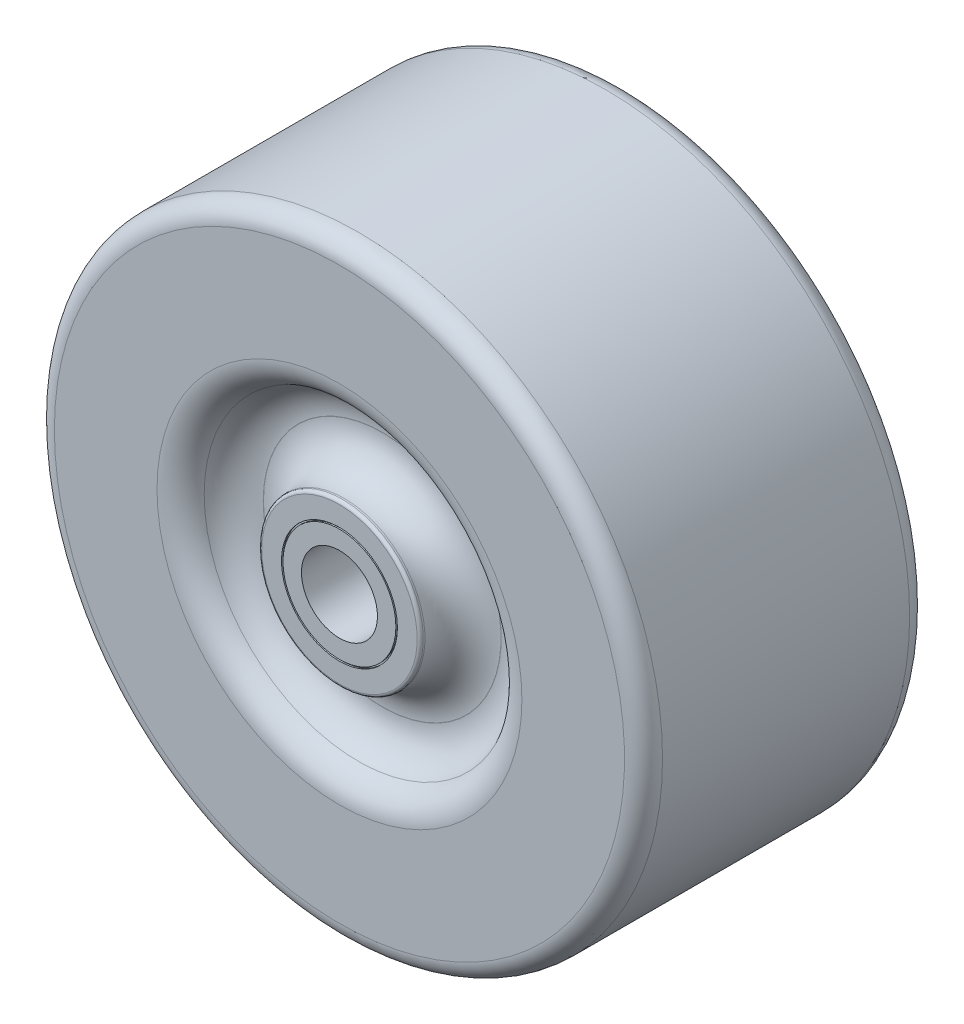
ISO-10303-21;
HEADER;
FILE_DESCRIPTION(('STEP AP214'),'2;1');
FILE_NAME('part.step','',(''),(''),'','','');
FILE_SCHEMA(('AUTOMOTIVE_DESIGN { 1 0 10303 214 1 1 1 1 }'));
ENDSEC;
DATA;
#1=APPLICATION_CONTEXT('core data for automotive mechanical design processes');
#2=APPLICATION_PROTOCOL_DEFINITION('international standard','automotive_design',2000,#1);
#3=PRODUCT_CONTEXT('',#1,'mechanical');
#4=PRODUCT('Part','Part','',(#3));
#5=PRODUCT_RELATED_PRODUCT_CATEGORY('part','',(#4));
#6=PRODUCT_DEFINITION_FORMATION('','',#4);
#7=PRODUCT_DEFINITION_CONTEXT('part definition',#1,'design');
#8=PRODUCT_DEFINITION('design','',#6,#7);
#9=PRODUCT_DEFINITION_SHAPE('','',#8);
#10=(LENGTH_UNIT() NAMED_UNIT(*) SI_UNIT(.MILLI.,.METRE.));
#11=(NAMED_UNIT(*) PLANE_ANGLE_UNIT() SI_UNIT($,.RADIAN.));
#12=(NAMED_UNIT(*) SI_UNIT($,.STERADIAN.) SOLID_ANGLE_UNIT());
#13=UNCERTAINTY_MEASURE_WITH_UNIT(LENGTH_MEASURE(1.E-05),#10,'distance_accuracy_value','');
#14=(GEOMETRIC_REPRESENTATION_CONTEXT(3) GLOBAL_UNCERTAINTY_ASSIGNED_CONTEXT((#13)) GLOBAL_UNIT_ASSIGNED_CONTEXT((#10,
#11,#12)) REPRESENTATION_CONTEXT('',''));
#15=CARTESIAN_POINT('',(0.,0.,0.));
#16=DIRECTION('',(0.,0.,1.));
#17=DIRECTION('',(1.,0.,0.));
#18=AXIS2_PLACEMENT_3D('',#15,#16,#17);
#19=CARTESIAN_POINT('',(4.71487499999999,0.,11.90625));
#20=DIRECTION('',(0.,0.,-1.));
#21=DIRECTION('',(-1.,0.,0.));
#22=AXIS2_PLACEMENT_3D('',#19,#20,#21);
#23=PLANE('',#22);
#24=CARTESIAN_POINT('',(0.,0.,11.90625));
#25=DIRECTION('',(0.,0.,1.));
#26=DIRECTION('',(1.,0.,0.));
#27=AXIS2_PLACEMENT_3D('',#24,#25,#26);
#28=CIRCLE('',#27,3.175);
#29=CARTESIAN_POINT('',(3.175,0.,11.90625));
#30=VERTEX_POINT('',#29);
#31=EDGE_CURVE('E90',#30,#30,#28,.T.);
#32=ORIENTED_EDGE('',*,*,#31,.F.);
#33=EDGE_LOOP('',(#32));
#34=FACE_BOUND('',#33,.T.);
#35=CARTESIAN_POINT('',(0.,0.,11.90625));
#36=DIRECTION('',(0.,0.,1.));
#37=DIRECTION('',(1.,0.,0.));
#38=AXIS2_PLACEMENT_3D('',#35,#36,#37);
#39=CIRCLE('',#38,4.71487499999999);
#40=CARTESIAN_POINT('',(4.71487499999999,0.,11.90625));
#41=VERTEX_POINT('',#40);
#42=EDGE_CURVE('E102',#41,#41,#39,.T.);
#43=ORIENTED_EDGE('',*,*,#42,.T.);
#44=EDGE_LOOP('',(#43));
#45=FACE_BOUND('',#44,.T.);
#46=ADVANCED_FACE('F37',(#34,#45),#23,.F.);
#47=CARTESIAN_POINT('',(0.,0.,16.1183378076554));
#48=DIRECTION('',(0.,0.,1.));
#49=DIRECTION('',(1.,0.,0.));
#50=AXIS2_PLACEMENT_3D('',#47,#48,#49);
#51=CYLINDRICAL_SURFACE('',#50,3.175);
#52=CARTESIAN_POINT('',(0.,0.,-11.90625));
#53=DIRECTION('',(0.,0.,1.));
#54=DIRECTION('',(1.,0.,0.));
#55=AXIS2_PLACEMENT_3D('',#52,#53,#54);
#56=CIRCLE('',#55,3.175);
#57=CARTESIAN_POINT('',(3.175,0.,-11.90625));
#58=VERTEX_POINT('',#57);
#59=EDGE_CURVE('E114',#58,#58,#56,.T.);
#60=ORIENTED_EDGE('',*,*,#59,.F.);
#61=EDGE_LOOP('',(#60));
#62=FACE_BOUND('',#61,.T.);
#63=ORIENTED_EDGE('',*,*,#31,.T.);
#64=EDGE_LOOP('',(#63));
#65=FACE_BOUND('',#64,.T.);
#66=ADVANCED_FACE('F150',(#62,#65),#51,.F.);
#67=CARTESIAN_POINT('',(0.,0.,16.1183378076554));
#68=DIRECTION('',(0.,0.,1.));
#69=DIRECTION('',(1.,0.,0.));
#70=AXIS2_PLACEMENT_3D('',#67,#68,#69);
#71=CYLINDRICAL_SURFACE('',#70,25.4);
#72=CARTESIAN_POINT('',(0.,0.,-10.31875));
#73=DIRECTION('',(0.,0.,1.));
#74=DIRECTION('',(1.,0.,0.));
#75=AXIS2_PLACEMENT_3D('',#72,#73,#74);
#76=CIRCLE('',#75,25.4);
#77=CARTESIAN_POINT('',(25.4,0.,-10.31875));
#78=VERTEX_POINT('',#77);
#79=EDGE_CURVE('E48',#78,#78,#76,.T.);
#80=ORIENTED_EDGE('',*,*,#79,.T.);
#81=EDGE_LOOP('',(#80));
#82=FACE_BOUND('',#81,.T.);
#83=CARTESIAN_POINT('',(0.,0.,10.31875));
#84=DIRECTION('',(0.,0.,-1.));
#85=DIRECTION('',(-1.,0.,0.));
#86=AXIS2_PLACEMENT_3D('',#83,#84,#85);
#87=CIRCLE('',#86,25.4);
#88=CARTESIAN_POINT('',(-25.4,0.,10.31875));
#89=VERTEX_POINT('',#88);
#90=EDGE_CURVE('E52',#89,#89,#87,.T.);
#91=ORIENTED_EDGE('',*,*,#90,.T.);
#92=EDGE_LOOP('',(#91));
#93=FACE_BOUND('',#92,.T.);
#94=ADVANCED_FACE('F156',(#82,#93),#71,.T.);
#95=CARTESIAN_POINT('',(25.4,0.,11.90625));
#96=DIRECTION('',(0.,0.,-1.));
#97=DIRECTION('',(-1.,0.,0.));
#98=AXIS2_PLACEMENT_3D('',#95,#96,#97);
#99=PLANE('',#98);
#100=CARTESIAN_POINT('',(0.,0.,11.90625));
#101=DIRECTION('',(0.,0.,-1.));
#102=DIRECTION('',(-1.,0.,0.));
#103=AXIS2_PLACEMENT_3D('',#100,#101,#102);
#104=CIRCLE('',#103,23.8125);
#105=CARTESIAN_POINT('',(-23.8125,0.,11.90625));
#106=VERTEX_POINT('',#105);
#107=EDGE_CURVE('E10',#106,#106,#104,.F.);
#108=ORIENTED_EDGE('',*,*,#107,.T.);
#109=EDGE_LOOP('',(#108));
#110=FACE_BOUND('',#109,.T.);
#111=CARTESIAN_POINT('',(0.,0.,11.90625));
#112=DIRECTION('',(0.,0.,-1.));
#113=DIRECTION('',(-1.,0.,0.));
#114=AXIS2_PLACEMENT_3D('',#111,#112,#113);
#115=CIRCLE('',#114,15.24);
#116=CARTESIAN_POINT('',(-15.24,0.,11.90625));
#117=VERTEX_POINT('',#116);
#118=EDGE_CURVE('E87',#117,#117,#115,.T.);
#119=ORIENTED_EDGE('',*,*,#118,.T.);
#120=EDGE_LOOP('',(#119));
#121=FACE_BOUND('',#120,.T.);
#122=ADVANCED_FACE('F188',(#110,#121),#99,.F.);
#123=CARTESIAN_POINT('',(12.7,0.,8.334375));
#124=DIRECTION('',(0.,0.,-1.));
#125=DIRECTION('',(-1.,0.,0.));
#126=AXIS2_PLACEMENT_3D('',#123,#124,#125);
#127=PLANE('',#126);
#128=CARTESIAN_POINT('',(0.,0.,8.334375));
#129=DIRECTION('',(0.,0.,-1.));
#130=DIRECTION('',(-1.,0.,0.));
#131=AXIS2_PLACEMENT_3D('',#128,#129,#130);
#132=CIRCLE('',#131,9.921875);
#133=CARTESIAN_POINT('',(-9.921875,0.,8.334375));
#134=VERTEX_POINT('',#133);
#135=EDGE_CURVE('E60',#134,#134,#132,.T.);
#136=ORIENTED_EDGE('',*,*,#135,.T.);
#137=EDGE_LOOP('',(#136));
#138=FACE_BOUND('',#137,.T.);
#139=CARTESIAN_POINT('',(0.,0.,8.334375));
#140=DIRECTION('',(0.,0.,-1.));
#141=DIRECTION('',(-1.,0.,0.));
#142=AXIS2_PLACEMENT_3D('',#139,#140,#141);
#143=CIRCLE('',#142,9.94205320578104);
#144=CARTESIAN_POINT('',(-9.94205320578104,0.,8.334375));
#145=VERTEX_POINT('',#144);
#146=EDGE_CURVE('E63',#145,#145,#143,.F.);
#147=ORIENTED_EDGE('',*,*,#146,.T.);
#148=EDGE_LOOP('',(#147));
#149=FACE_BOUND('',#148,.T.);
#150=ADVANCED_FACE('F184',(#138,#149),#127,.F.);
#151=CARTESIAN_POINT('',(0.,0.,16.1183378076554));
#152=DIRECTION('',(0.,0.,1.));
#153=DIRECTION('',(1.,0.,0.));
#154=AXIS2_PLACEMENT_3D('',#151,#152,#153);
#155=CYLINDRICAL_SURFACE('',#154,6.746875);
#156=CARTESIAN_POINT('',(0.,0.,11.509375));
#157=DIRECTION('',(0.,0.,-1.));
#158=DIRECTION('',(-1.,0.,0.));
#159=AXIS2_PLACEMENT_3D('',#156,#157,#158);
#160=CIRCLE('',#159,6.746875);
#161=CARTESIAN_POINT('',(-6.746875,0.,11.509375));
#162=VERTEX_POINT('',#161);
#163=EDGE_CURVE('E66',#162,#162,#160,.F.);
#164=ORIENTED_EDGE('',*,*,#163,.T.);
#165=EDGE_LOOP('',(#164));
#166=FACE_BOUND('',#165,.T.);
#167=CARTESIAN_POINT('',(0.,0.,11.65225));
#168=DIRECTION('',(0.,0.,-1.));
#169=DIRECTION('',(-1.,0.,0.));
#170=AXIS2_PLACEMENT_3D('',#167,#168,#169);
#171=CIRCLE('',#170,6.746875);
#172=CARTESIAN_POINT('',(-6.746875,0.,11.65225));
#173=VERTEX_POINT('',#172);
#174=EDGE_CURVE('E81',#173,#173,#171,.T.);
#175=ORIENTED_EDGE('',*,*,#174,.T.);
#176=EDGE_LOOP('',(#175));
#177=FACE_BOUND('',#176,.T.);
#178=ADVANCED_FACE('F180',(#166,#177),#155,.T.);
#179=CARTESIAN_POINT('',(6.74687499999999,0.,11.90625));
#180=DIRECTION('',(0.,0.,-1.));
#181=DIRECTION('',(-1.,0.,0.));
#182=AXIS2_PLACEMENT_3D('',#179,#180,#181);
#183=PLANE('',#182);
#184=CARTESIAN_POINT('',(0.,0.,11.90625));
#185=DIRECTION('',(0.,0.,1.));
#186=DIRECTION('',(1.,0.,0.));
#187=AXIS2_PLACEMENT_3D('',#184,#185,#186);
#188=CIRCLE('',#187,4.841875);
#189=CARTESIAN_POINT('',(4.841875,0.,11.90625));
#190=VERTEX_POINT('',#189);
#191=EDGE_CURVE('E93',#190,#190,#188,.T.);
#192=ORIENTED_EDGE('',*,*,#191,.F.);
#193=EDGE_LOOP('',(#192));
#194=FACE_BOUND('',#193,.T.);
#195=CARTESIAN_POINT('',(0.,0.,11.90625));
#196=DIRECTION('',(0.,0.,-1.));
#197=DIRECTION('',(-1.,0.,0.));
#198=AXIS2_PLACEMENT_3D('',#195,#196,#197);
#199=CIRCLE('',#198,6.492875);
#200=CARTESIAN_POINT('',(-6.492875,0.,11.90625));
#201=VERTEX_POINT('',#200);
#202=EDGE_CURVE('E84',#201,#201,#199,.F.);
#203=ORIENTED_EDGE('',*,*,#202,.T.);
#204=EDGE_LOOP('',(#203));
#205=FACE_BOUND('',#204,.T.);
#206=ADVANCED_FACE('F176',(#194,#205),#183,.F.);
#207=CARTESIAN_POINT('',(0.,0.,16.1183378076554));
#208=DIRECTION('',(0.,0.,1.));
#209=DIRECTION('',(1.,0.,0.));
#210=AXIS2_PLACEMENT_3D('',#207,#208,#209);
#211=CYLINDRICAL_SURFACE('',#210,4.841875);
#212=CARTESIAN_POINT('',(0.,0.,11.77925));
#213=DIRECTION('',(0.,0.,1.));
#214=DIRECTION('',(1.,0.,0.));
#215=AXIS2_PLACEMENT_3D('',#212,#213,#214);
#216=CIRCLE('',#215,4.841875);
#217=CARTESIAN_POINT('',(4.841875,0.,11.77925));
#218=VERTEX_POINT('',#217);
#219=EDGE_CURVE('E96',#218,#218,#216,.T.);
#220=ORIENTED_EDGE('',*,*,#219,.F.);
#221=EDGE_LOOP('',(#220));
#222=FACE_BOUND('',#221,.T.);
#223=ORIENTED_EDGE('',*,*,#191,.T.);
#224=EDGE_LOOP('',(#223));
#225=FACE_BOUND('',#224,.T.);
#226=ADVANCED_FACE('F172',(#222,#225),#211,.F.);
#227=CARTESIAN_POINT('',(4.841875,0.,11.77925));
#228=DIRECTION('',(0.,0.,-1.));
#229=DIRECTION('',(-1.,0.,0.));
#230=AXIS2_PLACEMENT_3D('',#227,#228,#229);
#231=PLANE('',#230);
#232=CARTESIAN_POINT('',(0.,0.,11.77925));
#233=DIRECTION('',(0.,0.,1.));
#234=DIRECTION('',(1.,0.,0.));
#235=AXIS2_PLACEMENT_3D('',#232,#233,#234);
#236=CIRCLE('',#235,4.71487499999999);
#237=CARTESIAN_POINT('',(4.71487499999999,0.,11.77925));
#238=VERTEX_POINT('',#237);
#239=EDGE_CURVE('E99',#238,#238,#236,.T.);
#240=ORIENTED_EDGE('',*,*,#239,.F.);
#241=EDGE_LOOP('',(#240));
#242=FACE_BOUND('',#241,.T.);
#243=ORIENTED_EDGE('',*,*,#219,.T.);
#244=EDGE_LOOP('',(#243));
#245=FACE_BOUND('',#244,.T.);
#246=ADVANCED_FACE('F168',(#242,#245),#231,.F.);
#247=CARTESIAN_POINT('',(0.,0.,16.1183378076554));
#248=DIRECTION('',(0.,0.,1.));
#249=DIRECTION('',(1.,0.,0.));
#250=AXIS2_PLACEMENT_3D('',#247,#248,#249);
#251=CYLINDRICAL_SURFACE('',#250,4.71487499999999);
#252=ORIENTED_EDGE('',*,*,#42,.F.);
#253=EDGE_LOOP('',(#252));
#254=FACE_BOUND('',#253,.T.);
#255=ORIENTED_EDGE('',*,*,#239,.T.);
#256=EDGE_LOOP('',(#255));
#257=FACE_BOUND('',#256,.T.);
#258=ADVANCED_FACE('F165',(#254,#257),#251,.T.);
#259=CARTESIAN_POINT('',(0.,0.,9.36625));
#260=DIRECTION('',(0.,0.,-1.));
#261=DIRECTION('',(-1.,0.,0.));
#262=AXIS2_PLACEMENT_3D('',#259,#260,#261);
#263=TOROIDAL_SURFACE('',#262,15.24,2.54);
#264=CARTESIAN_POINT('',(0.,0.,10.31875));
#265=DIRECTION('',(0.,0.,-1.));
#266=DIRECTION('',(-1.,0.,0.));
#267=AXIS2_PLACEMENT_3D('',#264,#265,#266);
#268=CIRCLE('',#267,12.8853569803471);
#269=CARTESIAN_POINT('',(-12.8853569803471,0.,10.31875));
#270=VERTEX_POINT('',#269);
#271=EDGE_CURVE('E57',#270,#270,#268,.T.);
#272=ORIENTED_EDGE('',*,*,#271,.T.);
#273=EDGE_LOOP('',(#272));
#274=FACE_BOUND('',#273,.T.);
#275=ORIENTED_EDGE('',*,*,#118,.F.);
#276=EDGE_LOOP('',(#275));
#277=FACE_BOUND('',#276,.T.);
#278=ADVANCED_FACE('F145',(#274,#277),#263,.T.);
#279=CARTESIAN_POINT('',(0.,0.,11.65225));
#280=DIRECTION('',(0.,0.,-1.));
#281=DIRECTION('',(-1.,0.,0.));
#282=AXIS2_PLACEMENT_3D('',#279,#280,#281);
#283=TOROIDAL_SURFACE('',#282,6.492875,0.254);
#284=ORIENTED_EDGE('',*,*,#202,.F.);
#285=EDGE_LOOP('',(#284));
#286=FACE_BOUND('',#285,.T.);
#287=ORIENTED_EDGE('',*,*,#174,.F.);
#288=EDGE_LOOP('',(#287));
#289=FACE_BOUND('',#288,.T.);
#290=ADVANCED_FACE('F136',(#286,#289),#283,.T.);
#291=CARTESIAN_POINT('',(4.71487499999999,0.,-11.90625));
#292=DIRECTION('',(0.,0.,1.));
#293=DIRECTION('',(-1.,0.,0.));
#294=AXIS2_PLACEMENT_3D('',#291,#292,#293);
#295=PLANE('',#294);
#296=ORIENTED_EDGE('',*,*,#59,.T.);
#297=EDGE_LOOP('',(#296));
#298=FACE_BOUND('',#297,.T.);
#299=CARTESIAN_POINT('',(0.,0.,-11.90625));
#300=DIRECTION('',(0.,0.,1.));
#301=DIRECTION('',(1.,0.,0.));
#302=AXIS2_PLACEMENT_3D('',#299,#300,#301);
#303=CIRCLE('',#302,4.71487499999999);
#304=CARTESIAN_POINT('',(4.71487499999999,0.,-11.90625));
#305=VERTEX_POINT('',#304);
#306=EDGE_CURVE('E126',#305,#305,#303,.T.);
#307=ORIENTED_EDGE('',*,*,#306,.F.);
#308=EDGE_LOOP('',(#307));
#309=FACE_BOUND('',#308,.T.);
#310=ADVANCED_FACE('F133',(#298,#309),#295,.F.);
#311=CARTESIAN_POINT('',(25.4,0.,-11.90625));
#312=DIRECTION('',(0.,0.,1.));
#313=DIRECTION('',(-1.,0.,0.));
#314=AXIS2_PLACEMENT_3D('',#311,#312,#313);
#315=PLANE('',#314);
#316=CARTESIAN_POINT('',(0.,0.,-11.90625));
#317=DIRECTION('',(0.,0.,1.));
#318=DIRECTION('',(1.,0.,0.));
#319=AXIS2_PLACEMENT_3D('',#316,#317,#318);
#320=CIRCLE('',#319,23.8125);
#321=CARTESIAN_POINT('',(23.8125,0.,-11.90625));
#322=VERTEX_POINT('',#321);
#323=EDGE_CURVE('E44',#322,#322,#320,.F.);
#324=ORIENTED_EDGE('',*,*,#323,.T.);
#325=EDGE_LOOP('',(#324));
#326=FACE_BOUND('',#325,.T.);
#327=CARTESIAN_POINT('',(0.,0.,-11.90625));
#328=DIRECTION('',(0.,0.,-1.));
#329=DIRECTION('',(-1.,0.,0.));
#330=AXIS2_PLACEMENT_3D('',#327,#328,#329);
#331=CIRCLE('',#330,15.24);
#332=CARTESIAN_POINT('',(-15.24,0.,-11.90625));
#333=VERTEX_POINT('',#332);
#334=EDGE_CURVE('E111',#333,#333,#331,.T.);
#335=ORIENTED_EDGE('',*,*,#334,.F.);
#336=EDGE_LOOP('',(#335));
#337=FACE_BOUND('',#336,.T.);
#338=ADVANCED_FACE('F135',(#326,#337),#315,.F.);
#339=CARTESIAN_POINT('',(12.7,0.,-8.334375));
#340=DIRECTION('',(0.,0.,1.));
#341=DIRECTION('',(-1.,0.,0.));
#342=AXIS2_PLACEMENT_3D('',#339,#340,#341);
#343=PLANE('',#342);
#344=CARTESIAN_POINT('',(0.,0.,-8.334375));
#345=DIRECTION('',(0.,0.,1.));
#346=DIRECTION('',(1.,0.,0.));
#347=AXIS2_PLACEMENT_3D('',#344,#345,#346);
#348=CIRCLE('',#347,9.921875);
#349=CARTESIAN_POINT('',(9.921875,0.,-8.334375));
#350=VERTEX_POINT('',#349);
#351=EDGE_CURVE('E75',#350,#350,#348,.T.);
#352=ORIENTED_EDGE('',*,*,#351,.T.);
#353=EDGE_LOOP('',(#352));
#354=FACE_BOUND('',#353,.T.);
#355=CARTESIAN_POINT('',(0.,0.,-8.334375));
#356=DIRECTION('',(0.,0.,1.));
#357=DIRECTION('',(1.,0.,0.));
#358=AXIS2_PLACEMENT_3D('',#355,#356,#357);
#359=CIRCLE('',#358,9.94205320578104);
#360=CARTESIAN_POINT('',(9.94205320578104,0.,-8.334375));
#361=VERTEX_POINT('',#360);
#362=EDGE_CURVE('E78',#361,#361,#359,.F.);
#363=ORIENTED_EDGE('',*,*,#362,.T.);
#364=EDGE_LOOP('',(#363));
#365=FACE_BOUND('',#364,.T.);
#366=ADVANCED_FACE('F143',(#354,#365),#343,.F.);
#367=CARTESIAN_POINT('',(0.,0.,-16.1183378076554));
#368=DIRECTION('',(0.,0.,-1.));
#369=DIRECTION('',(1.,0.,0.));
#370=AXIS2_PLACEMENT_3D('',#367,#368,#369);
#371=CYLINDRICAL_SURFACE('',#370,6.746875);
#372=CARTESIAN_POINT('',(0.,0.,-11.509375));
#373=DIRECTION('',(0.,0.,1.));
#374=DIRECTION('',(1.,0.,0.));
#375=AXIS2_PLACEMENT_3D('',#372,#373,#374);
#376=CIRCLE('',#375,6.746875);
#377=CARTESIAN_POINT('',(6.746875,0.,-11.509375));
#378=VERTEX_POINT('',#377);
#379=EDGE_CURVE('E72',#378,#378,#376,.F.);
#380=ORIENTED_EDGE('',*,*,#379,.T.);
#381=EDGE_LOOP('',(#380));
#382=FACE_BOUND('',#381,.T.);
#383=CARTESIAN_POINT('',(0.,0.,-11.65225));
#384=DIRECTION('',(0.,0.,-1.));
#385=DIRECTION('',(-1.,0.,0.));
#386=AXIS2_PLACEMENT_3D('',#383,#384,#385);
#387=CIRCLE('',#386,6.746875);
#388=CARTESIAN_POINT('',(-6.746875,0.,-11.65225));
#389=VERTEX_POINT('',#388);
#390=EDGE_CURVE('E105',#389,#389,#387,.T.);
#391=ORIENTED_EDGE('',*,*,#390,.F.);
#392=EDGE_LOOP('',(#391));
#393=FACE_BOUND('',#392,.T.);
#394=ADVANCED_FACE('F292',(#382,#393),#371,.T.);
#395=CARTESIAN_POINT('',(6.74687499999999,0.,-11.90625));
#396=DIRECTION('',(0.,0.,1.));
#397=DIRECTION('',(-1.,0.,0.));
#398=AXIS2_PLACEMENT_3D('',#395,#396,#397);
#399=PLANE('',#398);
#400=CARTESIAN_POINT('',(0.,0.,-11.90625));
#401=DIRECTION('',(0.,0.,1.));
#402=DIRECTION('',(1.,0.,0.));
#403=AXIS2_PLACEMENT_3D('',#400,#401,#402);
#404=CIRCLE('',#403,4.841875);
#405=CARTESIAN_POINT('',(4.841875,0.,-11.90625));
#406=VERTEX_POINT('',#405);
#407=EDGE_CURVE('E117',#406,#406,#404,.T.);
#408=ORIENTED_EDGE('',*,*,#407,.T.);
#409=EDGE_LOOP('',(#408));
#410=FACE_BOUND('',#409,.T.);
#411=CARTESIAN_POINT('',(0.,0.,-11.90625));
#412=DIRECTION('',(0.,0.,-1.));
#413=DIRECTION('',(-1.,0.,0.));
#414=AXIS2_PLACEMENT_3D('',#411,#412,#413);
#415=CIRCLE('',#414,6.492875);
#416=CARTESIAN_POINT('',(-6.492875,0.,-11.90625));
#417=VERTEX_POINT('',#416);
#418=EDGE_CURVE('E108',#417,#417,#415,.F.);
#419=ORIENTED_EDGE('',*,*,#418,.F.);
#420=EDGE_LOOP('',(#419));
#421=FACE_BOUND('',#420,.T.);
#422=ADVANCED_FACE('F297',(#410,#421),#399,.F.);
#423=CARTESIAN_POINT('',(0.,0.,-16.1183378076554));
#424=DIRECTION('',(0.,0.,-1.));
#425=DIRECTION('',(1.,0.,0.));
#426=AXIS2_PLACEMENT_3D('',#423,#424,#425);
#427=CYLINDRICAL_SURFACE('',#426,4.841875);
#428=CARTESIAN_POINT('',(0.,0.,-11.77925));
#429=DIRECTION('',(0.,0.,1.));
#430=DIRECTION('',(1.,0.,0.));
#431=AXIS2_PLACEMENT_3D('',#428,#429,#430);
#432=CIRCLE('',#431,4.841875);
#433=CARTESIAN_POINT('',(4.841875,0.,-11.77925));
#434=VERTEX_POINT('',#433);
#435=EDGE_CURVE('E120',#434,#434,#432,.T.);
#436=ORIENTED_EDGE('',*,*,#435,.T.);
#437=EDGE_LOOP('',(#436));
#438=FACE_BOUND('',#437,.T.);
#439=ORIENTED_EDGE('',*,*,#407,.F.);
#440=EDGE_LOOP('',(#439));
#441=FACE_BOUND('',#440,.T.);
#442=ADVANCED_FACE('F348',(#438,#441),#427,.F.);
#443=CARTESIAN_POINT('',(4.841875,0.,-11.77925));
#444=DIRECTION('',(0.,0.,1.));
#445=DIRECTION('',(-1.,0.,0.));
#446=AXIS2_PLACEMENT_3D('',#443,#444,#445);
#447=PLANE('',#446);
#448=CARTESIAN_POINT('',(0.,0.,-11.77925));
#449=DIRECTION('',(0.,0.,1.));
#450=DIRECTION('',(1.,0.,0.));
#451=AXIS2_PLACEMENT_3D('',#448,#449,#450);
#452=CIRCLE('',#451,4.71487499999999);
#453=CARTESIAN_POINT('',(4.71487499999999,0.,-11.77925));
#454=VERTEX_POINT('',#453);
#455=EDGE_CURVE('E123',#454,#454,#452,.T.);
#456=ORIENTED_EDGE('',*,*,#455,.T.);
#457=EDGE_LOOP('',(#456));
#458=FACE_BOUND('',#457,.T.);
#459=ORIENTED_EDGE('',*,*,#435,.F.);
#460=EDGE_LOOP('',(#459));
#461=FACE_BOUND('',#460,.T.);
#462=ADVANCED_FACE('F338',(#458,#461),#447,.F.);
#463=CARTESIAN_POINT('',(0.,0.,-16.1183378076554));
#464=DIRECTION('',(0.,0.,-1.));
#465=DIRECTION('',(1.,0.,0.));
#466=AXIS2_PLACEMENT_3D('',#463,#464,#465);
#467=CYLINDRICAL_SURFACE('',#466,4.71487499999999);
#468=ORIENTED_EDGE('',*,*,#306,.T.);
#469=EDGE_LOOP('',(#468));
#470=FACE_BOUND('',#469,.T.);
#471=ORIENTED_EDGE('',*,*,#455,.F.);
#472=EDGE_LOOP('',(#471));
#473=FACE_BOUND('',#472,.T.);
#474=ADVANCED_FACE('F130',(#470,#473),#467,.T.);
#475=CARTESIAN_POINT('',(0.,0.,-9.36625));
#476=DIRECTION('',(0.,0.,1.));
#477=DIRECTION('',(-1.,0.,0.));
#478=AXIS2_PLACEMENT_3D('',#475,#476,#477);
#479=TOROIDAL_SURFACE('',#478,15.24,2.54);
#480=CARTESIAN_POINT('',(0.,0.,-10.31875));
#481=DIRECTION('',(0.,0.,1.));
#482=DIRECTION('',(1.,0.,0.));
#483=AXIS2_PLACEMENT_3D('',#480,#481,#482);
#484=CIRCLE('',#483,12.8853569803471);
#485=CARTESIAN_POINT('',(12.8853569803471,0.,-10.31875));
#486=VERTEX_POINT('',#485);
#487=EDGE_CURVE('E69',#486,#486,#484,.T.);
#488=ORIENTED_EDGE('',*,*,#487,.T.);
#489=EDGE_LOOP('',(#488));
#490=FACE_BOUND('',#489,.T.);
#491=ORIENTED_EDGE('',*,*,#334,.T.);
#492=EDGE_LOOP('',(#491));
#493=FACE_BOUND('',#492,.T.);
#494=ADVANCED_FACE('F281',(#490,#493),#479,.T.);
#495=CARTESIAN_POINT('',(0.,0.,-11.65225));
#496=DIRECTION('',(0.,0.,1.));
#497=DIRECTION('',(-1.,0.,0.));
#498=AXIS2_PLACEMENT_3D('',#495,#496,#497);
#499=TOROIDAL_SURFACE('',#498,6.492875,0.254);
#500=ORIENTED_EDGE('',*,*,#418,.T.);
#501=EDGE_LOOP('',(#500));
#502=FACE_BOUND('',#501,.T.);
#503=ORIENTED_EDGE('',*,*,#390,.T.);
#504=EDGE_LOOP('',(#503));
#505=FACE_BOUND('',#504,.T.);
#506=ADVANCED_FACE('F163',(#502,#505),#499,.T.);
#507=CARTESIAN_POINT('',(0.,0.,-11.509375));
#508=DIRECTION('',(0.,0.,1.));
#509=DIRECTION('',(1.,0.,0.));
#510=AXIS2_PLACEMENT_3D('',#507,#508,#509);
#511=TOROIDAL_SURFACE('',#510,9.921875,3.175);
#512=ORIENTED_EDGE('',*,*,#379,.F.);
#513=EDGE_LOOP('',(#512));
#514=FACE_BOUND('',#513,.T.);
#515=ORIENTED_EDGE('',*,*,#351,.F.);
#516=EDGE_LOOP('',(#515));
#517=FACE_BOUND('',#516,.T.);
#518=ADVANCED_FACE('F198',(#514,#517),#511,.F.);
#519=CARTESIAN_POINT('',(0.,0.,-11.509375));
#520=DIRECTION('',(0.,0.,-1.));
#521=DIRECTION('',(-1.,0.,0.));
#522=AXIS2_PLACEMENT_3D('',#519,#520,#521);
#523=TOROIDAL_SURFACE('',#522,9.94205320578104,3.175);
#524=ORIENTED_EDGE('',*,*,#362,.F.);
#525=EDGE_LOOP('',(#524));
#526=FACE_BOUND('',#525,.T.);
#527=ORIENTED_EDGE('',*,*,#487,.F.);
#528=EDGE_LOOP('',(#527));
#529=FACE_BOUND('',#528,.T.);
#530=ADVANCED_FACE('F201',(#526,#529),#523,.F.);
#531=CARTESIAN_POINT('',(0.,0.,11.509375));
#532=DIRECTION('',(0.,0.,-1.));
#533=DIRECTION('',(-1.,0.,0.));
#534=AXIS2_PLACEMENT_3D('',#531,#532,#533);
#535=TOROIDAL_SURFACE('',#534,9.921875,3.175);
#536=ORIENTED_EDGE('',*,*,#135,.F.);
#537=EDGE_LOOP('',(#536));
#538=FACE_BOUND('',#537,.T.);
#539=ORIENTED_EDGE('',*,*,#163,.F.);
#540=EDGE_LOOP('',(#539));
#541=FACE_BOUND('',#540,.T.);
#542=ADVANCED_FACE('F205',(#538,#541),#535,.F.);
#543=CARTESIAN_POINT('',(0.,0.,11.509375));
#544=DIRECTION('',(0.,0.,1.));
#545=DIRECTION('',(1.,0.,0.));
#546=AXIS2_PLACEMENT_3D('',#543,#544,#545);
#547=TOROIDAL_SURFACE('',#546,9.94205320578104,3.175);
#548=ORIENTED_EDGE('',*,*,#271,.F.);
#549=EDGE_LOOP('',(#548));
#550=FACE_BOUND('',#549,.T.);
#551=ORIENTED_EDGE('',*,*,#146,.F.);
#552=EDGE_LOOP('',(#551));
#553=FACE_BOUND('',#552,.T.);
#554=ADVANCED_FACE('F209',(#550,#553),#547,.F.);
#555=CARTESIAN_POINT('',(0.,0.,-10.31875));
#556=DIRECTION('',(0.,0.,1.));
#557=DIRECTION('',(1.,0.,0.));
#558=AXIS2_PLACEMENT_3D('',#555,#556,#557);
#559=TOROIDAL_SURFACE('',#558,23.8125,1.5875);
#560=ORIENTED_EDGE('',*,*,#323,.F.);
#561=EDGE_LOOP('',(#560));
#562=FACE_BOUND('',#561,.T.);
#563=ORIENTED_EDGE('',*,*,#79,.F.);
#564=EDGE_LOOP('',(#563));
#565=FACE_BOUND('',#564,.T.);
#566=ADVANCED_FACE('F212',(#562,#565),#559,.T.);
#567=CARTESIAN_POINT('',(0.,0.,10.31875));
#568=DIRECTION('',(0.,0.,-1.));
#569=DIRECTION('',(-1.,0.,0.));
#570=AXIS2_PLACEMENT_3D('',#567,#568,#569);
#571=TOROIDAL_SURFACE('',#570,23.8125,1.5875);
#572=ORIENTED_EDGE('',*,*,#90,.F.);
#573=EDGE_LOOP('',(#572));
#574=FACE_BOUND('',#573,.T.);
#575=ORIENTED_EDGE('',*,*,#107,.F.);
#576=EDGE_LOOP('',(#575));
#577=FACE_BOUND('',#576,.T.);
#578=ADVANCED_FACE('F39',(#574,#577),#571,.T.);
#579=CLOSED_SHELL('',(#46,#66,#94,#122,#150,#178,#206,#226,#246,#258,#278,#290,#310,#338,#366,
#394,#422,#442,#462,#474,#494,#506,#518,#530,#542,#554,#566,#578));
#580=MANIFOLD_SOLID_BREP('B2',#579);
#581=ADVANCED_BREP_SHAPE_REPRESENTATION('',(#18,#580),#14);
#582=SHAPE_DEFINITION_REPRESENTATION(#9,#581);
ENDSEC;
END-ISO-10303-21;
